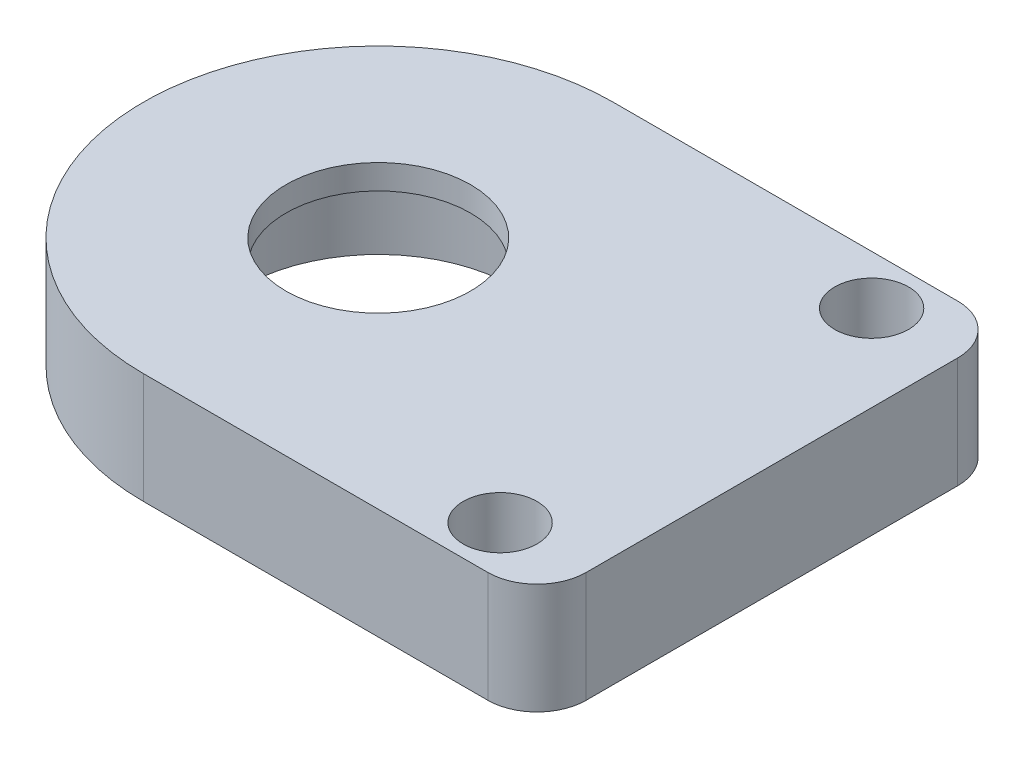
ISO-10303-21;
HEADER;
FILE_DESCRIPTION(('STEP AP214'),'2;1');
FILE_NAME('part.step','',(''),(''),'','','');
FILE_SCHEMA(('AUTOMOTIVE_DESIGN { 1 0 10303 214 1 1 1 1 }'));
ENDSEC;
DATA;
#1=APPLICATION_CONTEXT('core data for automotive mechanical design processes');
#2=APPLICATION_PROTOCOL_DEFINITION('international standard','automotive_design',2000,#1);
#3=PRODUCT_CONTEXT('',#1,'mechanical');
#4=PRODUCT('Part','Part','',(#3));
#5=PRODUCT_RELATED_PRODUCT_CATEGORY('part','',(#4));
#6=PRODUCT_DEFINITION_FORMATION('','',#4);
#7=PRODUCT_DEFINITION_CONTEXT('part definition',#1,'design');
#8=PRODUCT_DEFINITION('design','',#6,#7);
#9=PRODUCT_DEFINITION_SHAPE('','',#8);
#10=(LENGTH_UNIT() NAMED_UNIT(*) SI_UNIT(.MILLI.,.METRE.));
#11=(NAMED_UNIT(*) PLANE_ANGLE_UNIT() SI_UNIT($,.RADIAN.));
#12=(NAMED_UNIT(*) SI_UNIT($,.STERADIAN.) SOLID_ANGLE_UNIT());
#13=UNCERTAINTY_MEASURE_WITH_UNIT(LENGTH_MEASURE(1.E-05),#10,'distance_accuracy_value','');
#14=(GEOMETRIC_REPRESENTATION_CONTEXT(3) GLOBAL_UNCERTAINTY_ASSIGNED_CONTEXT((#13)) GLOBAL_UNIT_ASSIGNED_CONTEXT((#10,
#11,#12)) REPRESENTATION_CONTEXT('',''));
#15=CARTESIAN_POINT('',(0.,0.,0.));
#16=DIRECTION('',(0.,0.,1.));
#17=DIRECTION('',(1.,0.,0.));
#18=AXIS2_PLACEMENT_3D('',#15,#16,#17);
#19=CARTESIAN_POINT('',(25.,7.,15.0985931710274));
#20=DIRECTION('',(0.,-1.,0.));
#21=DIRECTION('',(0.,0.,-1.));
#22=AXIS2_PLACEMENT_3D('',#19,#20,#21);
#23=CYLINDRICAL_SURFACE('',#22,1.6);
#24=CARTESIAN_POINT('',(25.,0.,15.0985931710274));
#25=DIRECTION('',(0.,1.,0.));
#26=DIRECTION('',(0.,0.,1.));
#27=AXIS2_PLACEMENT_3D('',#24,#25,#26);
#28=CIRCLE('',#27,1.6);
#29=CARTESIAN_POINT('',(25.,0.,16.6985931710274));
#30=VERTEX_POINT('',#29);
#31=EDGE_CURVE('E131',#30,#30,#28,.T.);
#32=ORIENTED_EDGE('',*,*,#31,.F.);
#33=EDGE_LOOP('',(#32));
#34=FACE_BOUND('',#33,.T.);
#35=CARTESIAN_POINT('',(25.,2.5,15.0985931710274));
#36=DIRECTION('',(0.,1.,0.));
#37=DIRECTION('',(0.,0.,1.));
#38=AXIS2_PLACEMENT_3D('',#35,#36,#37);
#39=CIRCLE('',#38,1.6);
#40=CARTESIAN_POINT('',(25.,2.5,16.6985931710274));
#41=VERTEX_POINT('',#40);
#42=EDGE_CURVE('E150',#41,#41,#39,.T.);
#43=ORIENTED_EDGE('',*,*,#42,.T.);
#44=EDGE_LOOP('',(#43));
#45=FACE_BOUND('',#44,.T.);
#46=ADVANCED_FACE('F41',(#34,#45),#23,.F.);
#47=CARTESIAN_POINT('',(25.,7.,-15.0985931710274));
#48=DIRECTION('',(0.,-1.,0.));
#49=DIRECTION('',(0.,0.,-1.));
#50=AXIS2_PLACEMENT_3D('',#47,#48,#49);
#51=CYLINDRICAL_SURFACE('',#50,1.6);
#52=CARTESIAN_POINT('',(25.,0.,-15.0985931710274));
#53=DIRECTION('',(0.,1.,0.));
#54=DIRECTION('',(0.,0.,-1.));
#55=AXIS2_PLACEMENT_3D('',#52,#53,#54);
#56=CIRCLE('',#55,1.6);
#57=CARTESIAN_POINT('',(25.,0.,-16.6985931710274));
#58=VERTEX_POINT('',#57);
#59=EDGE_CURVE('E128',#58,#58,#56,.T.);
#60=ORIENTED_EDGE('',*,*,#59,.F.);
#61=EDGE_LOOP('',(#60));
#62=FACE_BOUND('',#61,.T.);
#63=CARTESIAN_POINT('',(25.,2.5,-15.0985931710274));
#64=DIRECTION('',(0.,1.,0.));
#65=DIRECTION('',(0.,0.,1.));
#66=AXIS2_PLACEMENT_3D('',#63,#64,#65);
#67=CIRCLE('',#66,1.6);
#68=CARTESIAN_POINT('',(25.,2.5,-13.4985931710274));
#69=VERTEX_POINT('',#68);
#70=EDGE_CURVE('E147',#69,#69,#67,.T.);
#71=ORIENTED_EDGE('',*,*,#70,.T.);
#72=EDGE_LOOP('',(#71));
#73=FACE_BOUND('',#72,.T.);
#74=ADVANCED_FACE('F185',(#62,#73),#51,.F.);
#75=CARTESIAN_POINT('',(0.,0.,0.));
#76=DIRECTION('',(0.,1.,0.));
#77=DIRECTION('',(0.,0.,1.));
#78=AXIS2_PLACEMENT_3D('',#75,#76,#77);
#79=PLANE('',#78);
#80=DIRECTION('',(-1.,0.,0.));
#81=VECTOR('',#80,1.);
#82=CARTESIAN_POINT('',(0.,0.,-19.0985931710274));
#83=LINE('',#82,#81);
#84=CARTESIAN_POINT('',(28.,0.,-19.0985931710274));
#85=VERTEX_POINT('',#84);
#86=CARTESIAN_POINT('',(0.,0.,-19.0985931710274));
#87=VERTEX_POINT('',#86);
#88=EDGE_CURVE('E144',#85,#87,#83,.T.);
#89=ORIENTED_EDGE('',*,*,#88,.F.);
#90=CARTESIAN_POINT('',(28.,0.,-15.0985931710274));
#91=DIRECTION('',(0.,1.,0.));
#92=DIRECTION('',(0.,0.,1.));
#93=AXIS2_PLACEMENT_3D('',#90,#91,#92);
#94=CIRCLE('',#93,4.);
#95=CARTESIAN_POINT('',(32.,0.,-15.0985931710274));
#96=VERTEX_POINT('',#95);
#97=EDGE_CURVE('E158',#85,#96,#94,.F.);
#98=ORIENTED_EDGE('',*,*,#97,.T.);
#99=DIRECTION('',(0.,0.,-1.));
#100=VECTOR('',#99,1.);
#101=CARTESIAN_POINT('',(32.,0.,-19.0985931710274));
#102=LINE('',#101,#100);
#103=CARTESIAN_POINT('',(32.,0.,15.0985931710274));
#104=VERTEX_POINT('',#103);
#105=EDGE_CURVE('E142',#104,#96,#102,.T.);
#106=ORIENTED_EDGE('',*,*,#105,.F.);
#107=CARTESIAN_POINT('',(28.,0.,15.0985931710274));
#108=DIRECTION('',(0.,1.,0.));
#109=DIRECTION('',(0.,0.,1.));
#110=AXIS2_PLACEMENT_3D('',#107,#108,#109);
#111=CIRCLE('',#110,4.);
#112=CARTESIAN_POINT('',(28.,0.,19.0985931710274));
#113=VERTEX_POINT('',#112);
#114=EDGE_CURVE('E156',#104,#113,#111,.F.);
#115=ORIENTED_EDGE('',*,*,#114,.T.);
#116=DIRECTION('',(1.,0.,0.));
#117=VECTOR('',#116,1.);
#118=CARTESIAN_POINT('',(32.,0.,19.0985931710274));
#119=LINE('',#118,#117);
#120=CARTESIAN_POINT('',(0.,0.,19.0985931710274));
#121=VERTEX_POINT('',#120);
#122=EDGE_CURVE('E140',#121,#113,#119,.T.);
#123=ORIENTED_EDGE('',*,*,#122,.F.);
#124=CARTESIAN_POINT('',(0.,0.,0.));
#125=DIRECTION('',(0.,1.,0.));
#126=DIRECTION('',(0.,0.,1.));
#127=AXIS2_PLACEMENT_3D('',#124,#125,#126);
#128=CIRCLE('',#127,19.0985931710274);
#129=EDGE_CURVE('E103',#87,#121,#128,.T.);
#130=ORIENTED_EDGE('',*,*,#129,.F.);
#131=EDGE_LOOP('',(#89,#98,#106,#115,#123,#130));
#132=FACE_BOUND('',#131,.T.);
#133=CARTESIAN_POINT('',(0.,0.,0.));
#134=DIRECTION('',(0.,1.,0.));
#135=DIRECTION('',(0.,0.,1.));
#136=AXIS2_PLACEMENT_3D('',#133,#134,#135);
#137=CIRCLE('',#136,11.075);
#138=CARTESIAN_POINT('',(0.,0.,11.075));
#139=VERTEX_POINT('',#138);
#140=EDGE_CURVE('E134',#139,#139,#137,.T.);
#141=ORIENTED_EDGE('',*,*,#140,.T.);
#142=EDGE_LOOP('',(#141));
#143=FACE_BOUND('',#142,.T.);
#144=ORIENTED_EDGE('',*,*,#31,.T.);
#145=EDGE_LOOP('',(#144));
#146=FACE_BOUND('',#145,.T.);
#147=ORIENTED_EDGE('',*,*,#59,.T.);
#148=EDGE_LOOP('',(#147));
#149=FACE_BOUND('',#148,.T.);
#150=ADVANCED_FACE('F174',(#132,#143,#146,#149),#79,.F.);
#151=CARTESIAN_POINT('',(0.,7.,0.));
#152=DIRECTION('',(0.,-1.,0.));
#153=DIRECTION('',(0.,0.,-1.));
#154=AXIS2_PLACEMENT_3D('',#151,#152,#153);
#155=CYLINDRICAL_SURFACE('',#154,19.0985931710274);
#156=ORIENTED_EDGE('',*,*,#129,.T.);
#157=DIRECTION('',(0.,-1.,0.));
#158=VECTOR('',#157,1.);
#159=CARTESIAN_POINT('',(0.,7.,19.0985931710274));
#160=LINE('',#159,#158);
#161=CARTESIAN_POINT('',(0.,9.,19.0985931710274));
#162=VERTEX_POINT('',#161);
#163=EDGE_CURVE('E97',#162,#121,#160,.T.);
#164=ORIENTED_EDGE('',*,*,#163,.F.);
#165=CARTESIAN_POINT('',(0.,9.,0.));
#166=DIRECTION('',(0.,1.,0.));
#167=DIRECTION('',(0.,0.,1.));
#168=AXIS2_PLACEMENT_3D('',#165,#166,#167);
#169=CIRCLE('',#168,19.0985931710274);
#170=CARTESIAN_POINT('',(0.,9.,-19.0985931710274));
#171=VERTEX_POINT('',#170);
#172=EDGE_CURVE('E101',#171,#162,#169,.T.);
#173=ORIENTED_EDGE('',*,*,#172,.F.);
#174=DIRECTION('',(0.,-1.,0.));
#175=VECTOR('',#174,1.);
#176=CARTESIAN_POINT('',(0.,7.,-19.0985931710274));
#177=LINE('',#176,#175);
#178=EDGE_CURVE('E105',#171,#87,#177,.T.);
#179=ORIENTED_EDGE('',*,*,#178,.T.);
#180=EDGE_LOOP('',(#156,#164,#173,#179));
#181=FACE_BOUND('',#180,.T.);
#182=ADVANCED_FACE('F98',(#181),#155,.T.);
#183=CARTESIAN_POINT('',(32.,7.,19.0985931710274));
#184=DIRECTION('',(0.,0.,-1.));
#185=DIRECTION('',(-1.,0.,0.));
#186=AXIS2_PLACEMENT_3D('',#183,#184,#185);
#187=PLANE('',#186);
#188=ORIENTED_EDGE('',*,*,#122,.T.);
#189=DIRECTION('',(0.,-1.,0.));
#190=VECTOR('',#189,1.);
#191=CARTESIAN_POINT('',(28.,7.,19.0985931710274));
#192=LINE('',#191,#190);
#193=CARTESIAN_POINT('',(28.,9.,19.0985931710274));
#194=VERTEX_POINT('',#193);
#195=EDGE_CURVE('E11',#113,#194,#192,.F.);
#196=ORIENTED_EDGE('',*,*,#195,.T.);
#197=DIRECTION('',(1.,0.,0.));
#198=VECTOR('',#197,1.);
#199=CARTESIAN_POINT('',(32.,9.,19.0985931710274));
#200=LINE('',#199,#198);
#201=EDGE_CURVE('E107',#162,#194,#200,.T.);
#202=ORIENTED_EDGE('',*,*,#201,.F.);
#203=ORIENTED_EDGE('',*,*,#163,.T.);
#204=EDGE_LOOP('',(#188,#196,#202,#203));
#205=FACE_BOUND('',#204,.T.);
#206=ADVANCED_FACE('F108',(#205),#187,.F.);
#207=CARTESIAN_POINT('',(32.,7.,-19.0985931710274));
#208=DIRECTION('',(-1.,0.,0.));
#209=DIRECTION('',(0.,0.,1.));
#210=AXIS2_PLACEMENT_3D('',#207,#208,#209);
#211=PLANE('',#210);
#212=ORIENTED_EDGE('',*,*,#105,.T.);
#213=DIRECTION('',(0.,-1.,0.));
#214=VECTOR('',#213,1.);
#215=CARTESIAN_POINT('',(32.,7.,-15.0985931710274));
#216=LINE('',#215,#214);
#217=CARTESIAN_POINT('',(32.,9.,-15.0985931710274));
#218=VERTEX_POINT('',#217);
#219=EDGE_CURVE('E62',#96,#218,#216,.F.);
#220=ORIENTED_EDGE('',*,*,#219,.T.);
#221=DIRECTION('',(0.,0.,-1.));
#222=VECTOR('',#221,1.);
#223=CARTESIAN_POINT('',(32.,9.,-19.0985931710274));
#224=LINE('',#223,#222);
#225=CARTESIAN_POINT('',(32.,9.,15.0985931710274));
#226=VERTEX_POINT('',#225);
#227=EDGE_CURVE('E111',#226,#218,#224,.T.);
#228=ORIENTED_EDGE('',*,*,#227,.F.);
#229=DIRECTION('',(0.,-1.,0.));
#230=VECTOR('',#229,1.);
#231=CARTESIAN_POINT('',(32.,7.,15.0985931710274));
#232=LINE('',#231,#230);
#233=EDGE_CURVE('E160',#226,#104,#232,.T.);
#234=ORIENTED_EDGE('',*,*,#233,.T.);
#235=EDGE_LOOP('',(#212,#220,#228,#234));
#236=FACE_BOUND('',#235,.T.);
#237=ADVANCED_FACE('F176',(#236),#211,.F.);
#238=CARTESIAN_POINT('',(0.,7.,-19.0985931710274));
#239=DIRECTION('',(0.,0.,1.));
#240=DIRECTION('',(1.,0.,0.));
#241=AXIS2_PLACEMENT_3D('',#238,#239,#240);
#242=PLANE('',#241);
#243=DIRECTION('',(-1.,0.,0.));
#244=VECTOR('',#243,1.);
#245=CARTESIAN_POINT('',(0.,9.,-19.0985931710274));
#246=LINE('',#245,#244);
#247=CARTESIAN_POINT('',(28.,9.,-19.0985931710274));
#248=VERTEX_POINT('',#247);
#249=EDGE_CURVE('E116',#248,#171,#246,.T.);
#250=ORIENTED_EDGE('',*,*,#249,.F.);
#251=DIRECTION('',(0.,-1.,0.));
#252=VECTOR('',#251,1.);
#253=CARTESIAN_POINT('',(28.,7.,-19.0985931710274));
#254=LINE('',#253,#252);
#255=EDGE_CURVE('E104',#248,#85,#254,.T.);
#256=ORIENTED_EDGE('',*,*,#255,.T.);
#257=ORIENTED_EDGE('',*,*,#88,.T.);
#258=ORIENTED_EDGE('',*,*,#178,.F.);
#259=EDGE_LOOP('',(#250,#256,#257,#258));
#260=FACE_BOUND('',#259,.T.);
#261=ADVANCED_FACE('F169',(#260),#242,.F.);
#262=CARTESIAN_POINT('',(0.,7.,0.));
#263=DIRECTION('',(0.,-1.,0.));
#264=DIRECTION('',(0.,0.,-1.));
#265=AXIS2_PLACEMENT_3D('',#262,#263,#264);
#266=CYLINDRICAL_SURFACE('',#265,11.075);
#267=CARTESIAN_POINT('',(0.,7.,0.));
#268=DIRECTION('',(0.,1.,0.));
#269=DIRECTION('',(0.,0.,1.));
#270=AXIS2_PLACEMENT_3D('',#267,#268,#269);
#271=CIRCLE('',#270,11.075);
#272=CARTESIAN_POINT('',(0.,7.,11.075));
#273=VERTEX_POINT('',#272);
#274=EDGE_CURVE('E127',#273,#273,#271,.T.);
#275=ORIENTED_EDGE('',*,*,#274,.T.);
#276=EDGE_LOOP('',(#275));
#277=FACE_BOUND('',#276,.T.);
#278=ORIENTED_EDGE('',*,*,#140,.F.);
#279=EDGE_LOOP('',(#278));
#280=FACE_BOUND('',#279,.T.);
#281=ADVANCED_FACE('F198',(#277,#280),#266,.F.);
#282=CARTESIAN_POINT('',(0.,9.,0.));
#283=DIRECTION('',(0.,-1.,0.));
#284=DIRECTION('',(0.,0.,-1.));
#285=AXIS2_PLACEMENT_3D('',#282,#283,#284);
#286=CYLINDRICAL_SURFACE('',#285,7.5);
#287=CARTESIAN_POINT('',(0.,9.,0.));
#288=DIRECTION('',(0.,1.,0.));
#289=DIRECTION('',(0.,0.,1.));
#290=AXIS2_PLACEMENT_3D('',#287,#288,#289);
#291=CIRCLE('',#290,7.5);
#292=CARTESIAN_POINT('',(0.,9.,7.5));
#293=VERTEX_POINT('',#292);
#294=EDGE_CURVE('E118',#293,#293,#291,.T.);
#295=ORIENTED_EDGE('',*,*,#294,.T.);
#296=EDGE_LOOP('',(#295));
#297=FACE_BOUND('',#296,.T.);
#298=CARTESIAN_POINT('',(0.,7.,0.));
#299=DIRECTION('',(0.,1.,0.));
#300=DIRECTION('',(0.,0.,1.));
#301=AXIS2_PLACEMENT_3D('',#298,#299,#300);
#302=CIRCLE('',#301,7.5);
#303=CARTESIAN_POINT('',(0.,7.,7.5));
#304=VERTEX_POINT('',#303);
#305=EDGE_CURVE('E121',#304,#304,#302,.T.);
#306=ORIENTED_EDGE('',*,*,#305,.F.);
#307=EDGE_LOOP('',(#306));
#308=FACE_BOUND('',#307,.T.);
#309=ADVANCED_FACE('F201',(#297,#308),#286,.F.);
#310=CARTESIAN_POINT('',(0.,9.,0.));
#311=DIRECTION('',(0.,1.,0.));
#312=DIRECTION('',(0.,0.,1.));
#313=AXIS2_PLACEMENT_3D('',#310,#311,#312);
#314=PLANE('',#313);
#315=CARTESIAN_POINT('',(25.,9.,-15.0985931710274));
#316=DIRECTION('',(0.,1.,0.));
#317=DIRECTION('',(0.,0.,1.));
#318=AXIS2_PLACEMENT_3D('',#315,#316,#317);
#319=CIRCLE('',#318,3.);
#320=CARTESIAN_POINT('',(25.,9.,-12.0985931710274));
#321=VERTEX_POINT('',#320);
#322=EDGE_CURVE('E347',#321,#321,#319,.T.);
#323=ORIENTED_EDGE('',*,*,#322,.F.);
#324=EDGE_LOOP('',(#323));
#325=FACE_BOUND('',#324,.T.);
#326=CARTESIAN_POINT('',(25.,9.,15.0985931710274));
#327=DIRECTION('',(0.,1.,0.));
#328=DIRECTION('',(0.,0.,1.));
#329=AXIS2_PLACEMENT_3D('',#326,#327,#328);
#330=CIRCLE('',#329,3.);
#331=CARTESIAN_POINT('',(25.,9.,18.0985931710274));
#332=VERTEX_POINT('',#331);
#333=EDGE_CURVE('E350',#332,#332,#330,.T.);
#334=ORIENTED_EDGE('',*,*,#333,.F.);
#335=EDGE_LOOP('',(#334));
#336=FACE_BOUND('',#335,.T.);
#337=ORIENTED_EDGE('',*,*,#227,.T.);
#338=CARTESIAN_POINT('',(28.,9.,-15.0985931710274));
#339=DIRECTION('',(0.,1.,0.));
#340=DIRECTION('',(0.,0.,1.));
#341=AXIS2_PLACEMENT_3D('',#338,#339,#340);
#342=CIRCLE('',#341,4.);
#343=EDGE_CURVE('E49',#218,#248,#342,.T.);
#344=ORIENTED_EDGE('',*,*,#343,.T.);
#345=ORIENTED_EDGE('',*,*,#249,.T.);
#346=ORIENTED_EDGE('',*,*,#172,.T.);
#347=ORIENTED_EDGE('',*,*,#201,.T.);
#348=CARTESIAN_POINT('',(28.,9.,15.0985931710274));
#349=DIRECTION('',(0.,1.,0.));
#350=DIRECTION('',(0.,0.,1.));
#351=AXIS2_PLACEMENT_3D('',#348,#349,#350);
#352=CIRCLE('',#351,4.);
#353=EDGE_CURVE('E164',#194,#226,#352,.T.);
#354=ORIENTED_EDGE('',*,*,#353,.T.);
#355=EDGE_LOOP('',(#337,#344,#345,#346,#347,#354));
#356=FACE_BOUND('',#355,.T.);
#357=ORIENTED_EDGE('',*,*,#294,.F.);
#358=EDGE_LOOP('',(#357));
#359=FACE_BOUND('',#358,.T.);
#360=ADVANCED_FACE('F113',(#325,#336,#356,#359),#314,.T.);
#361=CARTESIAN_POINT('',(0.,7.,0.));
#362=DIRECTION('',(0.,1.,0.));
#363=DIRECTION('',(0.,0.,1.));
#364=AXIS2_PLACEMENT_3D('',#361,#362,#363);
#365=PLANE('',#364);
#366=ORIENTED_EDGE('',*,*,#305,.T.);
#367=EDGE_LOOP('',(#366));
#368=FACE_BOUND('',#367,.T.);
#369=ORIENTED_EDGE('',*,*,#274,.F.);
#370=EDGE_LOOP('',(#369));
#371=FACE_BOUND('',#370,.T.);
#372=ADVANCED_FACE('F230',(#368,#371),#365,.F.);
#373=CARTESIAN_POINT('',(25.,2.5,15.0985931710274));
#374=DIRECTION('',(0.,1.,0.));
#375=DIRECTION('',(0.,0.,1.));
#376=AXIS2_PLACEMENT_3D('',#373,#374,#375);
#377=CYLINDRICAL_SURFACE('',#376,3.);
#378=CARTESIAN_POINT('',(25.,2.5,15.0985931710274));
#379=DIRECTION('',(0.,1.,0.));
#380=DIRECTION('',(0.,0.,1.));
#381=AXIS2_PLACEMENT_3D('',#378,#379,#380);
#382=CIRCLE('',#381,3.);
#383=CARTESIAN_POINT('',(25.,2.5,18.0985931710274));
#384=VERTEX_POINT('',#383);
#385=EDGE_CURVE('E352',#384,#384,#382,.T.);
#386=CARTESIAN_POINT('',(25.,2.5,18.0985931710274));
#387=CARTESIAN_POINT('',(25.,2.56770833333333,18.0985931710274));
#388=CARTESIAN_POINT('',(25.,2.63541666666667,18.0985931710274));
#389=CARTESIAN_POINT('',(25.,2.77083333333333,18.0985931710274));
#390=CARTESIAN_POINT('',(25.,2.83854166666667,18.0985931710274));
#391=CARTESIAN_POINT('',(25.,2.97395833333333,18.0985931710274));
#392=CARTESIAN_POINT('',(25.,3.04166666666667,18.0985931710274));
#393=CARTESIAN_POINT('',(25.,3.17708333333333,18.0985931710274));
#394=CARTESIAN_POINT('',(25.,3.24479166666667,18.0985931710274));
#395=CARTESIAN_POINT('',(25.,3.38020833333333,18.0985931710274));
#396=CARTESIAN_POINT('',(25.,3.44791666666667,18.0985931710274));
#397=CARTESIAN_POINT('',(25.,3.58333333333333,18.0985931710274));
#398=CARTESIAN_POINT('',(25.,3.65104166666667,18.0985931710274));
#399=CARTESIAN_POINT('',(25.,3.78645833333333,18.0985931710274));
#400=CARTESIAN_POINT('',(25.,3.85416666666667,18.0985931710274));
#401=CARTESIAN_POINT('',(25.,3.98958333333333,18.0985931710274));
#402=CARTESIAN_POINT('',(25.,4.05729166666667,18.0985931710274));
#403=CARTESIAN_POINT('',(25.,4.19270833333333,18.0985931710274));
#404=CARTESIAN_POINT('',(25.,4.26041666666667,18.0985931710274));
#405=CARTESIAN_POINT('',(25.,4.39583333333333,18.0985931710274));
#406=CARTESIAN_POINT('',(25.,4.46354166666667,18.0985931710274));
#407=CARTESIAN_POINT('',(25.,4.59895833333333,18.0985931710274));
#408=CARTESIAN_POINT('',(25.,4.66666666666667,18.0985931710274));
#409=CARTESIAN_POINT('',(25.,4.80208333333333,18.0985931710274));
#410=CARTESIAN_POINT('',(25.,4.86979166666667,18.0985931710274));
#411=CARTESIAN_POINT('',(25.,5.00520833333333,18.0985931710274));
#412=CARTESIAN_POINT('',(25.,5.07291666666667,18.0985931710274));
#413=CARTESIAN_POINT('',(25.,5.20833333333333,18.0985931710274));
#414=CARTESIAN_POINT('',(25.,5.27604166666667,18.0985931710274));
#415=CARTESIAN_POINT('',(25.,5.41145833333333,18.0985931710274));
#416=CARTESIAN_POINT('',(25.,5.47916666666667,18.0985931710274));
#417=CARTESIAN_POINT('',(25.,5.61458333333333,18.0985931710274));
#418=CARTESIAN_POINT('',(25.,5.68229166666667,18.0985931710274));
#419=CARTESIAN_POINT('',(25.,5.81770833333333,18.0985931710274));
#420=CARTESIAN_POINT('',(25.,5.88541666666667,18.0985931710274));
#421=CARTESIAN_POINT('',(25.,6.02083333333333,18.0985931710274));
#422=CARTESIAN_POINT('',(25.,6.08854166666667,18.0985931710274));
#423=CARTESIAN_POINT('',(25.,6.22395833333333,18.0985931710274));
#424=CARTESIAN_POINT('',(25.,6.29166666666667,18.0985931710274));
#425=CARTESIAN_POINT('',(25.,6.42708333333333,18.0985931710274));
#426=CARTESIAN_POINT('',(25.,6.49479166666667,18.0985931710274));
#427=CARTESIAN_POINT('',(25.,6.63020833333333,18.0985931710274));
#428=CARTESIAN_POINT('',(25.,6.69791666666667,18.0985931710274));
#429=CARTESIAN_POINT('',(25.,6.83333333333333,18.0985931710274));
#430=CARTESIAN_POINT('',(25.,6.90104166666667,18.0985931710274));
#431=CARTESIAN_POINT('',(25.,7.03645833333333,18.0985931710274));
#432=CARTESIAN_POINT('',(25.,7.10416666666667,18.0985931710274));
#433=CARTESIAN_POINT('',(25.,7.23958333333333,18.0985931710274));
#434=CARTESIAN_POINT('',(25.,7.30729166666667,18.0985931710274));
#435=CARTESIAN_POINT('',(25.,7.44270833333333,18.0985931710274));
#436=CARTESIAN_POINT('',(25.,7.51041666666667,18.0985931710274));
#437=CARTESIAN_POINT('',(25.,7.64583333333333,18.0985931710274));
#438=CARTESIAN_POINT('',(25.,7.71354166666667,18.0985931710274));
#439=CARTESIAN_POINT('',(25.,7.84895833333333,18.0985931710274));
#440=CARTESIAN_POINT('',(25.,7.91666666666667,18.0985931710274));
#441=CARTESIAN_POINT('',(25.,8.05208333333333,18.0985931710274));
#442=CARTESIAN_POINT('',(25.,8.11979166666667,18.0985931710274));
#443=CARTESIAN_POINT('',(25.,8.25520833333333,18.0985931710274));
#444=CARTESIAN_POINT('',(25.,8.32291666666667,18.0985931710274));
#445=CARTESIAN_POINT('',(25.,8.45833333333333,18.0985931710274));
#446=CARTESIAN_POINT('',(25.,8.52604166666667,18.0985931710274));
#447=CARTESIAN_POINT('',(25.,8.66145833333333,18.0985931710274));
#448=CARTESIAN_POINT('',(25.,8.72916666666667,18.0985931710274));
#449=CARTESIAN_POINT('',(25.,8.86458333333333,18.0985931710274));
#450=CARTESIAN_POINT('',(25.,8.93229166666667,18.0985931710274));
#451=CARTESIAN_POINT('',(25.,9.,18.0985931710274));
#452=B_SPLINE_CURVE_WITH_KNOTS('',3,(#386,#387,#388,#389,#390,#391,#392,#393,#394,#395,#396,
#397,#398,#399,#400,#401,#402,#403,#404,#405,#406,#407,#408,#409,#410,#411,#412,#413,#414,#415,
#416,#417,#418,#419,#420,#421,#422,#423,#424,#425,#426,#427,#428,#429,#430,#431,#432,#433,#434,
#435,#436,#437,#438,#439,#440,#441,#442,#443,#444,#445,#446,#447,#448,#449,#450,#451),
.UNSPECIFIED.,.F.,.F.,(4,2,2,2,2,2,2,2,2,2,2,2,2,2,2,2,2,2,2,2,2,2,2,2,2,2,2,2,2,2,2,2,4),(0.,
0.203125,0.40625,0.609375,0.8125,1.015625,1.21875,1.421875,1.625,1.828125,2.03125,2.234375,
2.4375,2.640625,2.84375,3.046875,3.25,3.453125,3.65625,3.859375,4.0625,4.265625,4.46875,
4.671875,4.875,5.078125,5.28125,5.484375,5.6875,5.890625,6.09375,6.296875,6.5),.UNSPECIFIED.);
#453=EDGE_CURVE('BSEAM233',#384,#332,#452,.T.);
#454=ORIENTED_EDGE('',*,*,#385,.F.);
#455=ORIENTED_EDGE('',*,*,#333,.T.);
#456=ORIENTED_EDGE('',*,*,#453,.T.);
#457=ORIENTED_EDGE('',*,*,#453,.F.);
#458=EDGE_LOOP('',(#454,#456,#455,#457));
#459=FACE_BOUND('',#458,.T.);
#460=ADVANCED_FACE('F233',(#459),#377,.F.);
#461=CARTESIAN_POINT('',(25.,2.5,15.0985931710274));
#462=DIRECTION('',(0.,1.,0.));
#463=DIRECTION('',(0.,0.,1.));
#464=AXIS2_PLACEMENT_3D('',#461,#462,#463);
#465=PLANE('',#464);
#466=ORIENTED_EDGE('',*,*,#42,.F.);
#467=EDGE_LOOP('',(#466));
#468=FACE_BOUND('',#467,.T.);
#469=ORIENTED_EDGE('',*,*,#385,.T.);
#470=EDGE_LOOP('',(#469));
#471=FACE_BOUND('',#470,.T.);
#472=ADVANCED_FACE('F258',(#468,#471),#465,.T.);
#473=CARTESIAN_POINT('',(25.,2.5,-15.0985931710274));
#474=DIRECTION('',(0.,1.,0.));
#475=DIRECTION('',(0.,0.,1.));
#476=AXIS2_PLACEMENT_3D('',#473,#474,#475);
#477=CYLINDRICAL_SURFACE('',#476,3.);
#478=CARTESIAN_POINT('',(25.,2.5,-15.0985931710274));
#479=DIRECTION('',(0.,1.,0.));
#480=DIRECTION('',(0.,0.,1.));
#481=AXIS2_PLACEMENT_3D('',#478,#479,#480);
#482=CIRCLE('',#481,3.);
#483=CARTESIAN_POINT('',(25.,2.5,-12.0985931710274));
#484=VERTEX_POINT('',#483);
#485=EDGE_CURVE('E151',#484,#484,#482,.T.);
#486=CARTESIAN_POINT('',(25.,2.5,-12.0985931710274));
#487=CARTESIAN_POINT('',(25.,2.56770833333333,-12.0985931710274));
#488=CARTESIAN_POINT('',(25.,2.63541666666667,-12.0985931710274));
#489=CARTESIAN_POINT('',(25.,2.77083333333333,-12.0985931710274));
#490=CARTESIAN_POINT('',(25.,2.83854166666667,-12.0985931710274));
#491=CARTESIAN_POINT('',(25.,2.97395833333333,-12.0985931710274));
#492=CARTESIAN_POINT('',(25.,3.04166666666667,-12.0985931710274));
#493=CARTESIAN_POINT('',(25.,3.17708333333333,-12.0985931710274));
#494=CARTESIAN_POINT('',(25.,3.24479166666667,-12.0985931710274));
#495=CARTESIAN_POINT('',(25.,3.38020833333333,-12.0985931710274));
#496=CARTESIAN_POINT('',(25.,3.44791666666667,-12.0985931710274));
#497=CARTESIAN_POINT('',(25.,3.58333333333333,-12.0985931710274));
#498=CARTESIAN_POINT('',(25.,3.65104166666667,-12.0985931710274));
#499=CARTESIAN_POINT('',(25.,3.78645833333333,-12.0985931710274));
#500=CARTESIAN_POINT('',(25.,3.85416666666667,-12.0985931710274));
#501=CARTESIAN_POINT('',(25.,3.98958333333333,-12.0985931710274));
#502=CARTESIAN_POINT('',(25.,4.05729166666667,-12.0985931710274));
#503=CARTESIAN_POINT('',(25.,4.19270833333333,-12.0985931710274));
#504=CARTESIAN_POINT('',(25.,4.26041666666667,-12.0985931710274));
#505=CARTESIAN_POINT('',(25.,4.39583333333333,-12.0985931710274));
#506=CARTESIAN_POINT('',(25.,4.46354166666667,-12.0985931710274));
#507=CARTESIAN_POINT('',(25.,4.59895833333333,-12.0985931710274));
#508=CARTESIAN_POINT('',(25.,4.66666666666667,-12.0985931710274));
#509=CARTESIAN_POINT('',(25.,4.80208333333333,-12.0985931710274));
#510=CARTESIAN_POINT('',(25.,4.86979166666667,-12.0985931710274));
#511=CARTESIAN_POINT('',(25.,5.00520833333333,-12.0985931710274));
#512=CARTESIAN_POINT('',(25.,5.07291666666667,-12.0985931710274));
#513=CARTESIAN_POINT('',(25.,5.20833333333333,-12.0985931710274));
#514=CARTESIAN_POINT('',(25.,5.27604166666667,-12.0985931710274));
#515=CARTESIAN_POINT('',(25.,5.41145833333333,-12.0985931710274));
#516=CARTESIAN_POINT('',(25.,5.47916666666667,-12.0985931710274));
#517=CARTESIAN_POINT('',(25.,5.61458333333333,-12.0985931710274));
#518=CARTESIAN_POINT('',(25.,5.68229166666667,-12.0985931710274));
#519=CARTESIAN_POINT('',(25.,5.81770833333333,-12.0985931710274));
#520=CARTESIAN_POINT('',(25.,5.88541666666667,-12.0985931710274));
#521=CARTESIAN_POINT('',(25.,6.02083333333333,-12.0985931710274));
#522=CARTESIAN_POINT('',(25.,6.08854166666667,-12.0985931710274));
#523=CARTESIAN_POINT('',(25.,6.22395833333333,-12.0985931710274));
#524=CARTESIAN_POINT('',(25.,6.29166666666667,-12.0985931710274));
#525=CARTESIAN_POINT('',(25.,6.42708333333333,-12.0985931710274));
#526=CARTESIAN_POINT('',(25.,6.49479166666667,-12.0985931710274));
#527=CARTESIAN_POINT('',(25.,6.63020833333333,-12.0985931710274));
#528=CARTESIAN_POINT('',(25.,6.69791666666667,-12.0985931710274));
#529=CARTESIAN_POINT('',(25.,6.83333333333333,-12.0985931710274));
#530=CARTESIAN_POINT('',(25.,6.90104166666667,-12.0985931710274));
#531=CARTESIAN_POINT('',(25.,7.03645833333333,-12.0985931710274));
#532=CARTESIAN_POINT('',(25.,7.10416666666667,-12.0985931710274));
#533=CARTESIAN_POINT('',(25.,7.23958333333333,-12.0985931710274));
#534=CARTESIAN_POINT('',(25.,7.30729166666667,-12.0985931710274));
#535=CARTESIAN_POINT('',(25.,7.44270833333333,-12.0985931710274));
#536=CARTESIAN_POINT('',(25.,7.51041666666667,-12.0985931710274));
#537=CARTESIAN_POINT('',(25.,7.64583333333333,-12.0985931710274));
#538=CARTESIAN_POINT('',(25.,7.71354166666667,-12.0985931710274));
#539=CARTESIAN_POINT('',(25.,7.84895833333333,-12.0985931710274));
#540=CARTESIAN_POINT('',(25.,7.91666666666667,-12.0985931710274));
#541=CARTESIAN_POINT('',(25.,8.05208333333333,-12.0985931710274));
#542=CARTESIAN_POINT('',(25.,8.11979166666667,-12.0985931710274));
#543=CARTESIAN_POINT('',(25.,8.25520833333333,-12.0985931710274));
#544=CARTESIAN_POINT('',(25.,8.32291666666667,-12.0985931710274));
#545=CARTESIAN_POINT('',(25.,8.45833333333333,-12.0985931710274));
#546=CARTESIAN_POINT('',(25.,8.52604166666667,-12.0985931710274));
#547=CARTESIAN_POINT('',(25.,8.66145833333333,-12.0985931710274));
#548=CARTESIAN_POINT('',(25.,8.72916666666667,-12.0985931710274));
#549=CARTESIAN_POINT('',(25.,8.86458333333333,-12.0985931710274));
#550=CARTESIAN_POINT('',(25.,8.93229166666667,-12.0985931710274));
#551=CARTESIAN_POINT('',(25.,9.,-12.0985931710274));
#552=B_SPLINE_CURVE_WITH_KNOTS('',3,(#486,#487,#488,#489,#490,#491,#492,#493,#494,#495,#496,
#497,#498,#499,#500,#501,#502,#503,#504,#505,#506,#507,#508,#509,#510,#511,#512,#513,#514,#515,
#516,#517,#518,#519,#520,#521,#522,#523,#524,#525,#526,#527,#528,#529,#530,#531,#532,#533,#534,
#535,#536,#537,#538,#539,#540,#541,#542,#543,#544,#545,#546,#547,#548,#549,#550,#551),
.UNSPECIFIED.,.F.,.F.,(4,2,2,2,2,2,2,2,2,2,2,2,2,2,2,2,2,2,2,2,2,2,2,2,2,2,2,2,2,2,2,2,4),(0.,
0.203125,0.40625,0.609375,0.8125,1.015625,1.21875,1.421875,1.625,1.828125,2.03125,2.234375,
2.4375,2.640625,2.84375,3.046875,3.25,3.453125,3.65625,3.859375,4.0625,4.265625,4.46875,
4.671875,4.875,5.078125,5.28125,5.484375,5.6875,5.890625,6.09375,6.296875,6.5),.UNSPECIFIED.);
#553=EDGE_CURVE('BSEAM268',#484,#321,#552,.T.);
#554=ORIENTED_EDGE('',*,*,#485,.F.);
#555=ORIENTED_EDGE('',*,*,#322,.T.);
#556=ORIENTED_EDGE('',*,*,#553,.T.);
#557=ORIENTED_EDGE('',*,*,#553,.F.);
#558=EDGE_LOOP('',(#554,#556,#555,#557));
#559=FACE_BOUND('',#558,.T.);
#560=ADVANCED_FACE('F268',(#559),#477,.F.);
#561=CARTESIAN_POINT('',(25.,2.5,-15.0985931710274));
#562=DIRECTION('',(0.,1.,0.));
#563=DIRECTION('',(0.,0.,1.));
#564=AXIS2_PLACEMENT_3D('',#561,#562,#563);
#565=PLANE('',#564);
#566=ORIENTED_EDGE('',*,*,#70,.F.);
#567=EDGE_LOOP('',(#566));
#568=FACE_BOUND('',#567,.T.);
#569=ORIENTED_EDGE('',*,*,#485,.T.);
#570=EDGE_LOOP('',(#569));
#571=FACE_BOUND('',#570,.T.);
#572=ADVANCED_FACE('F183',(#568,#571),#565,.T.);
#573=CARTESIAN_POINT('',(28.,7.,-15.0985931710274));
#574=DIRECTION('',(0.,-1.,0.));
#575=DIRECTION('',(0.,0.,-1.));
#576=AXIS2_PLACEMENT_3D('',#573,#574,#575);
#577=CYLINDRICAL_SURFACE('',#576,4.);
#578=ORIENTED_EDGE('',*,*,#343,.F.);
#579=ORIENTED_EDGE('',*,*,#219,.F.);
#580=ORIENTED_EDGE('',*,*,#97,.F.);
#581=ORIENTED_EDGE('',*,*,#255,.F.);
#582=EDGE_LOOP('',(#578,#579,#580,#581));
#583=FACE_BOUND('',#582,.T.);
#584=ADVANCED_FACE('F171',(#583),#577,.T.);
#585=CARTESIAN_POINT('',(28.,7.,15.0985931710274));
#586=DIRECTION('',(0.,-1.,0.));
#587=DIRECTION('',(0.,0.,-1.));
#588=AXIS2_PLACEMENT_3D('',#585,#586,#587);
#589=CYLINDRICAL_SURFACE('',#588,4.);
#590=ORIENTED_EDGE('',*,*,#353,.F.);
#591=ORIENTED_EDGE('',*,*,#195,.F.);
#592=ORIENTED_EDGE('',*,*,#114,.F.);
#593=ORIENTED_EDGE('',*,*,#233,.F.);
#594=EDGE_LOOP('',(#590,#591,#592,#593));
#595=FACE_BOUND('',#594,.T.);
#596=ADVANCED_FACE('F43',(#595),#589,.T.);
#597=CLOSED_SHELL('',(#46,#74,#150,#182,#206,#237,#261,#281,#309,#360,#372,#460,#472,#560,#572,
#584,#596));
#598=MANIFOLD_SOLID_BREP('B2',#597);
#599=ADVANCED_BREP_SHAPE_REPRESENTATION('',(#18,#598),#14);
#600=SHAPE_DEFINITION_REPRESENTATION(#9,#599);
ENDSEC;
END-ISO-10303-21;
